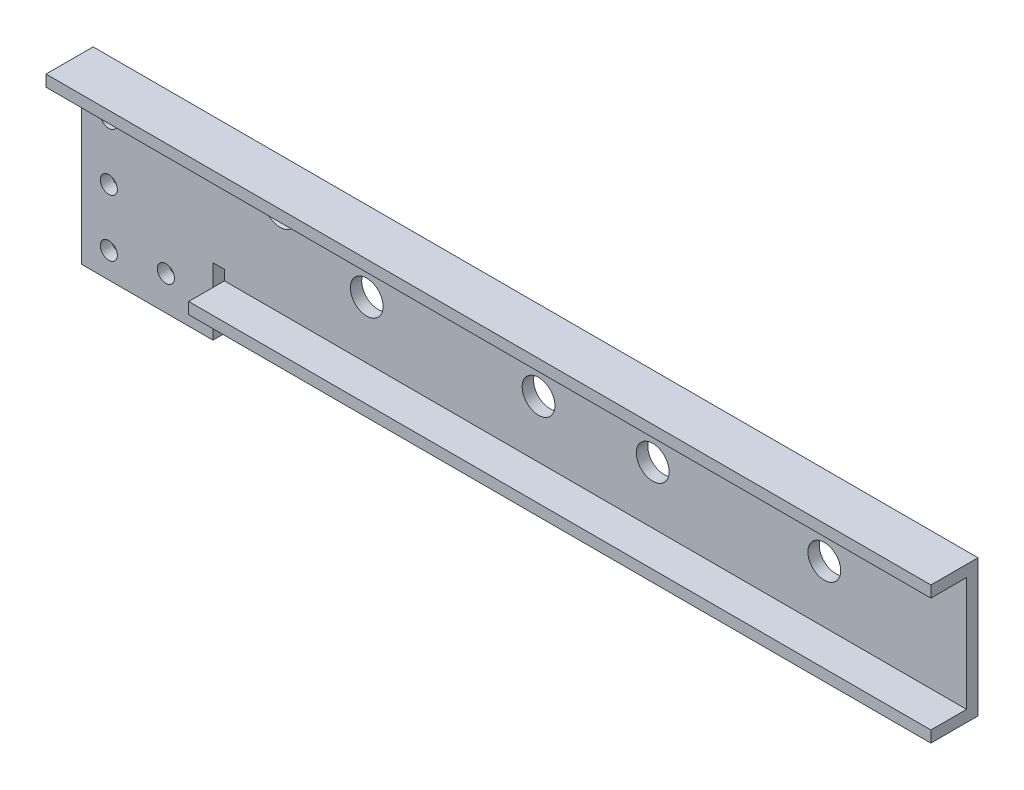
ISO-10303-21;
HEADER;
FILE_DESCRIPTION(('STEP AP214'),'2;1');
FILE_NAME('part.step','',(''),(''),'','','');
FILE_SCHEMA(('AUTOMOTIVE_DESIGN { 1 0 10303 214 1 1 1 1 }'));
ENDSEC;
DATA;
#1=APPLICATION_CONTEXT('core data for automotive mechanical design processes');
#2=APPLICATION_PROTOCOL_DEFINITION('international standard','automotive_design',2000,#1);
#3=PRODUCT_CONTEXT('',#1,'mechanical');
#4=PRODUCT('Part','Part','',(#3));
#5=PRODUCT_RELATED_PRODUCT_CATEGORY('part','',(#4));
#6=PRODUCT_DEFINITION_FORMATION('','',#4);
#7=PRODUCT_DEFINITION_CONTEXT('part definition',#1,'design');
#8=PRODUCT_DEFINITION('design','',#6,#7);
#9=PRODUCT_DEFINITION_SHAPE('','',#8);
#10=(LENGTH_UNIT() NAMED_UNIT(*) SI_UNIT(.MILLI.,.METRE.));
#11=(NAMED_UNIT(*) PLANE_ANGLE_UNIT() SI_UNIT($,.RADIAN.));
#12=(NAMED_UNIT(*) SI_UNIT($,.STERADIAN.) SOLID_ANGLE_UNIT());
#13=UNCERTAINTY_MEASURE_WITH_UNIT(LENGTH_MEASURE(1.E-05),#10,'distance_accuracy_value','');
#14=(GEOMETRIC_REPRESENTATION_CONTEXT(3) GLOBAL_UNCERTAINTY_ASSIGNED_CONTEXT((#13)) GLOBAL_UNIT_ASSIGNED_CONTEXT((#10,
#11,#12)) REPRESENTATION_CONTEXT('',''));
#15=CARTESIAN_POINT('',(0.,0.,0.));
#16=DIRECTION('',(0.,0.,1.));
#17=DIRECTION('',(1.,0.,0.));
#18=AXIS2_PLACEMENT_3D('',#15,#16,#17);
#19=CARTESIAN_POINT('',(0.,0.,2.));
#20=DIRECTION('',(0.,0.,1.));
#21=DIRECTION('',(1.,0.,0.));
#22=AXIS2_PLACEMENT_3D('',#19,#20,#21);
#23=PLANE('',#22);
#24=CARTESIAN_POINT('',(34.75,-6.00000000000005,2.));
#25=DIRECTION('',(0.,0.,1.));
#26=DIRECTION('',(1.,0.,0.));
#27=AXIS2_PLACEMENT_3D('',#24,#25,#26);
#28=CIRCLE('',#27,3.00000000000002);
#29=CARTESIAN_POINT('',(37.75,-6.00000000000005,2.));
#30=VERTEX_POINT('',#29);
#31=EDGE_CURVE('E11',#30,#30,#28,.F.);
#32=ORIENTED_EDGE('',*,*,#31,.T.);
#33=EDGE_LOOP('',(#32));
#34=FACE_BOUND('',#33,.T.);
#35=CARTESIAN_POINT('',(14.75,-6.00000000000005,2.));
#36=DIRECTION('',(0.,0.,1.));
#37=DIRECTION('',(1.,0.,0.));
#38=AXIS2_PLACEMENT_3D('',#35,#36,#37);
#39=CIRCLE('',#38,1.5);
#40=CARTESIAN_POINT('',(16.25,-6.00000000000005,2.));
#41=VERTEX_POINT('',#40);
#42=EDGE_CURVE('E165',#41,#41,#39,.T.);
#43=ORIENTED_EDGE('',*,*,#42,.F.);
#44=EDGE_LOOP('',(#43));
#45=FACE_BOUND('',#44,.T.);
#46=CARTESIAN_POINT('',(14.75,-26.0000000000001,2.));
#47=DIRECTION('',(0.,0.,1.));
#48=DIRECTION('',(1.,0.,0.));
#49=AXIS2_PLACEMENT_3D('',#46,#47,#48);
#50=CIRCLE('',#49,1.5);
#51=CARTESIAN_POINT('',(16.25,-26.0000000000001,2.));
#52=VERTEX_POINT('',#51);
#53=EDGE_CURVE('E160',#52,#52,#50,.T.);
#54=ORIENTED_EDGE('',*,*,#53,.F.);
#55=EDGE_LOOP('',(#54));
#56=FACE_BOUND('',#55,.T.);
#57=CARTESIAN_POINT('',(100.025,-12.,2.));
#58=DIRECTION('',(0.,0.,1.));
#59=DIRECTION('',(1.,0.,0.));
#60=AXIS2_PLACEMENT_3D('',#57,#58,#59);
#61=CIRCLE('',#60,2.875);
#62=CARTESIAN_POINT('',(102.9,-12.,2.));
#63=VERTEX_POINT('',#62);
#64=EDGE_CURVE('E150',#63,#63,#61,.T.);
#65=ORIENTED_EDGE('',*,*,#64,.F.);
#66=EDGE_LOOP('',(#65));
#67=FACE_BOUND('',#66,.T.);
#68=CARTESIAN_POINT('',(80.025,-12.,2.));
#69=DIRECTION('',(0.,0.,1.));
#70=DIRECTION('',(1.,0.,0.));
#71=AXIS2_PLACEMENT_3D('',#68,#69,#70);
#72=CIRCLE('',#71,2.875);
#73=CARTESIAN_POINT('',(82.9,-12.,2.));
#74=VERTEX_POINT('',#73);
#75=EDGE_CURVE('E288',#74,#74,#72,.T.);
#76=ORIENTED_EDGE('',*,*,#75,.F.);
#77=EDGE_LOOP('',(#76));
#78=FACE_BOUND('',#77,.T.);
#79=CARTESIAN_POINT('',(49.925,-12.,2.));
#80=DIRECTION('',(0.,0.,1.));
#81=DIRECTION('',(1.,0.,0.));
#82=AXIS2_PLACEMENT_3D('',#79,#80,#81);
#83=CIRCLE('',#82,2.875);
#84=CARTESIAN_POINT('',(52.8,-12.,2.));
#85=VERTEX_POINT('',#84);
#86=EDGE_CURVE('E159',#85,#85,#83,.T.);
#87=ORIENTED_EDGE('',*,*,#86,.F.);
#88=EDGE_LOOP('',(#87));
#89=FACE_BOUND('',#88,.T.);
#90=CARTESIAN_POINT('',(130.075,-12.,2.));
#91=DIRECTION('',(0.,0.,1.));
#92=DIRECTION('',(1.,0.,0.));
#93=AXIS2_PLACEMENT_3D('',#90,#91,#92);
#94=CIRCLE('',#93,2.87499999999999);
#95=CARTESIAN_POINT('',(132.95,-12.,2.));
#96=VERTEX_POINT('',#95);
#97=EDGE_CURVE('E145',#96,#96,#94,.T.);
#98=ORIENTED_EDGE('',*,*,#97,.F.);
#99=EDGE_LOOP('',(#98));
#100=FACE_BOUND('',#99,.T.);
#101=CARTESIAN_POINT('',(4.75,-17.5,2.));
#102=DIRECTION('',(0.,0.,1.));
#103=DIRECTION('',(1.,0.,0.));
#104=AXIS2_PLACEMENT_3D('',#101,#102,#103);
#105=CIRCLE('',#104,1.5);
#106=CARTESIAN_POINT('',(6.25,-17.5,2.));
#107=VERTEX_POINT('',#106);
#108=EDGE_CURVE('E138',#107,#107,#105,.T.);
#109=ORIENTED_EDGE('',*,*,#108,.F.);
#110=EDGE_LOOP('',(#109));
#111=FACE_BOUND('',#110,.T.);
#112=CARTESIAN_POINT('',(4.75,-7.50000000000001,2.));
#113=DIRECTION('',(0.,0.,1.));
#114=DIRECTION('',(1.,0.,0.));
#115=AXIS2_PLACEMENT_3D('',#112,#113,#114);
#116=CIRCLE('',#115,1.5);
#117=CARTESIAN_POINT('',(6.25,-7.50000000000001,2.));
#118=VERTEX_POINT('',#117);
#119=EDGE_CURVE('E144',#118,#118,#116,.T.);
#120=ORIENTED_EDGE('',*,*,#119,.F.);
#121=EDGE_LOOP('',(#120));
#122=FACE_BOUND('',#121,.T.);
#123=CARTESIAN_POINT('',(4.75,-27.5,2.));
#124=DIRECTION('',(0.,0.,1.));
#125=DIRECTION('',(1.,0.,0.));
#126=AXIS2_PLACEMENT_3D('',#123,#124,#125);
#127=CIRCLE('',#126,1.5);
#128=CARTESIAN_POINT('',(6.25,-27.5,2.));
#129=VERTEX_POINT('',#128);
#130=EDGE_CURVE('E133',#129,#129,#127,.T.);
#131=ORIENTED_EDGE('',*,*,#130,.F.);
#132=EDGE_LOOP('',(#131));
#133=FACE_BOUND('',#132,.T.);
#134=DIRECTION('',(0.,-1.,0.));
#135=VECTOR('',#134,1.);
#136=CARTESIAN_POINT('',(23.,-32.,2.));
#137=LINE('',#136,#135);
#138=CARTESIAN_POINT('',(23.,-20.25,2.));
#139=VERTEX_POINT('',#138);
#140=CARTESIAN_POINT('',(23.,-32.,2.));
#141=VERTEX_POINT('',#140);
#142=EDGE_CURVE('E267',#139,#141,#137,.T.);
#143=ORIENTED_EDGE('',*,*,#142,.F.);
#144=DIRECTION('',(-1.,0.,0.));
#145=VECTOR('',#144,1.);
#146=CARTESIAN_POINT('',(23.,-20.25,2.));
#147=LINE('',#146,#145);
#148=CARTESIAN_POINT('',(25.,-20.25,2.));
#149=VERTEX_POINT('',#148);
#150=EDGE_CURVE('E273',#149,#139,#147,.T.);
#151=ORIENTED_EDGE('',*,*,#150,.F.);
#152=DIRECTION('',(0.,1.,0.));
#153=VECTOR('',#152,1.);
#154=CARTESIAN_POINT('',(25.,-24.,2.));
#155=LINE('',#154,#153);
#156=CARTESIAN_POINT('',(25.,-22.,2.));
#157=VERTEX_POINT('',#156);
#158=EDGE_CURVE('E132',#157,#149,#155,.T.);
#159=ORIENTED_EDGE('',*,*,#158,.F.);
#160=DIRECTION('',(-1.,0.,0.));
#161=VECTOR('',#160,1.);
#162=CARTESIAN_POINT('',(155.,-22.,2.));
#163=LINE('',#162,#161);
#164=CARTESIAN_POINT('',(155.,-22.,2.));
#165=VERTEX_POINT('',#164);
#166=EDGE_CURVE('E249',#165,#157,#163,.T.);
#167=ORIENTED_EDGE('',*,*,#166,.F.);
#168=DIRECTION('',(0.,1.,0.));
#169=VECTOR('',#168,1.);
#170=CARTESIAN_POINT('',(155.,0.,2.));
#171=LINE('',#170,#169);
#172=CARTESIAN_POINT('',(155.,-2.,2.));
#173=VERTEX_POINT('',#172);
#174=EDGE_CURVE('E115',#165,#173,#171,.T.);
#175=ORIENTED_EDGE('',*,*,#174,.T.);
#176=DIRECTION('',(1.,0.,0.));
#177=VECTOR('',#176,1.);
#178=CARTESIAN_POINT('',(155.,-2.,2.));
#179=LINE('',#178,#177);
#180=CARTESIAN_POINT('',(0.,-2.00000000000001,2.));
#181=VERTEX_POINT('',#180);
#182=EDGE_CURVE('E53',#181,#173,#179,.T.);
#183=ORIENTED_EDGE('',*,*,#182,.F.);
#184=DIRECTION('',(0.,-1.,0.));
#185=VECTOR('',#184,1.);
#186=CARTESIAN_POINT('',(0.,0.,2.));
#187=LINE('',#186,#185);
#188=CARTESIAN_POINT('',(0.,-32.,2.));
#189=VERTEX_POINT('',#188);
#190=EDGE_CURVE('E58',#181,#189,#187,.T.);
#191=ORIENTED_EDGE('',*,*,#190,.T.);
#192=DIRECTION('',(1.,0.,0.));
#193=VECTOR('',#192,1.);
#194=CARTESIAN_POINT('',(0.,-32.,2.));
#195=LINE('',#194,#193);
#196=EDGE_CURVE('E111',#189,#141,#195,.T.);
#197=ORIENTED_EDGE('',*,*,#196,.T.);
#198=EDGE_LOOP('',(#143,#151,#159,#167,#175,#183,#191,#197));
#199=FACE_BOUND('',#198,.T.);
#200=ADVANCED_FACE('F38',(#34,#45,#56,#67,#78,#89,#100,#111,#122,#133,#199),#23,.T.);
#201=CARTESIAN_POINT('',(0.,0.,2.));
#202=DIRECTION('',(1.,0.,0.));
#203=DIRECTION('',(0.,1.,0.));
#204=AXIS2_PLACEMENT_3D('',#201,#202,#203);
#205=PLANE('',#204);
#206=DIRECTION('',(0.,-1.,0.));
#207=VECTOR('',#206,1.);
#208=CARTESIAN_POINT('',(0.,0.,0.));
#209=LINE('',#208,#207);
#210=CARTESIAN_POINT('',(0.,0.,0.));
#211=VERTEX_POINT('',#210);
#212=CARTESIAN_POINT('',(0.,-32.,0.));
#213=VERTEX_POINT('',#212);
#214=EDGE_CURVE('E107',#211,#213,#209,.T.);
#215=ORIENTED_EDGE('',*,*,#214,.T.);
#216=DIRECTION('',(0.,0.,-1.));
#217=VECTOR('',#216,1.);
#218=CARTESIAN_POINT('',(0.,-32.,2.));
#219=LINE('',#218,#217);
#220=EDGE_CURVE('E100',#189,#213,#219,.T.);
#221=ORIENTED_EDGE('',*,*,#220,.F.);
#222=ORIENTED_EDGE('',*,*,#190,.F.);
#223=DIRECTION('',(0.,0.,-1.));
#224=VECTOR('',#223,1.);
#225=CARTESIAN_POINT('',(0.,-2.00000000000002,8.25));
#226=LINE('',#225,#224);
#227=CARTESIAN_POINT('',(0.,-2.00000000000002,8.25));
#228=VERTEX_POINT('',#227);
#229=EDGE_CURVE('E217',#228,#181,#226,.T.);
#230=ORIENTED_EDGE('',*,*,#229,.F.);
#231=DIRECTION('',(0.,-1.,0.));
#232=VECTOR('',#231,1.);
#233=CARTESIAN_POINT('',(0.,0.,8.25));
#234=LINE('',#233,#232);
#235=CARTESIAN_POINT('',(0.,0.,8.25));
#236=VERTEX_POINT('',#235);
#237=EDGE_CURVE('E234',#236,#228,#234,.T.);
#238=ORIENTED_EDGE('',*,*,#237,.F.);
#239=DIRECTION('',(0.,0.,-1.));
#240=VECTOR('',#239,1.);
#241=CARTESIAN_POINT('',(0.,0.,2.));
#242=LINE('',#241,#240);
#243=EDGE_CURVE('E101',#236,#211,#242,.T.);
#244=ORIENTED_EDGE('',*,*,#243,.T.);
#245=EDGE_LOOP('',(#215,#221,#222,#230,#238,#244));
#246=FACE_BOUND('',#245,.T.);
#247=ADVANCED_FACE('F183',(#246),#205,.F.);
#248=CARTESIAN_POINT('',(0.,-32.,2.));
#249=DIRECTION('',(0.,1.,0.));
#250=DIRECTION('',(0.,0.,1.));
#251=AXIS2_PLACEMENT_3D('',#248,#249,#250);
#252=PLANE('',#251);
#253=DIRECTION('',(1.,0.,0.));
#254=VECTOR('',#253,1.);
#255=CARTESIAN_POINT('',(0.,-32.,0.));
#256=LINE('',#255,#254);
#257=CARTESIAN_POINT('',(23.,-32.,0.));
#258=VERTEX_POINT('',#257);
#259=EDGE_CURVE('E91',#213,#258,#256,.T.);
#260=ORIENTED_EDGE('',*,*,#259,.T.);
#261=DIRECTION('',(0.,0.,1.));
#262=VECTOR('',#261,1.);
#263=CARTESIAN_POINT('',(23.,-32.,-4.25));
#264=LINE('',#263,#262);
#265=EDGE_CURVE('E212',#258,#141,#264,.T.);
#266=ORIENTED_EDGE('',*,*,#265,.T.);
#267=ORIENTED_EDGE('',*,*,#196,.F.);
#268=ORIENTED_EDGE('',*,*,#220,.T.);
#269=EDGE_LOOP('',(#260,#266,#267,#268));
#270=FACE_BOUND('',#269,.T.);
#271=ADVANCED_FACE('F189',(#270),#252,.F.);
#272=CARTESIAN_POINT('',(155.,0.,2.));
#273=DIRECTION('',(-1.,0.,0.));
#274=DIRECTION('',(0.,0.,1.));
#275=AXIS2_PLACEMENT_3D('',#272,#273,#274);
#276=PLANE('',#275);
#277=DIRECTION('',(0.,0.,-1.));
#278=VECTOR('',#277,1.);
#279=CARTESIAN_POINT('',(155.,-24.,8.25));
#280=LINE('',#279,#278);
#281=CARTESIAN_POINT('',(155.,-24.,8.25));
#282=VERTEX_POINT('',#281);
#283=CARTESIAN_POINT('',(155.,-24.,0.));
#284=VERTEX_POINT('',#283);
#285=EDGE_CURVE('E85',#282,#284,#280,.T.);
#286=ORIENTED_EDGE('',*,*,#285,.T.);
#287=DIRECTION('',(0.,1.,0.));
#288=VECTOR('',#287,1.);
#289=CARTESIAN_POINT('',(155.,0.,0.));
#290=LINE('',#289,#288);
#291=CARTESIAN_POINT('',(155.,0.,0.));
#292=VERTEX_POINT('',#291);
#293=EDGE_CURVE('E75',#284,#292,#290,.T.);
#294=ORIENTED_EDGE('',*,*,#293,.T.);
#295=DIRECTION('',(0.,0.,-1.));
#296=VECTOR('',#295,1.);
#297=CARTESIAN_POINT('',(155.,0.,2.));
#298=LINE('',#297,#296);
#299=CARTESIAN_POINT('',(155.,0.,8.25));
#300=VERTEX_POINT('',#299);
#301=EDGE_CURVE('E80',#300,#292,#298,.T.);
#302=ORIENTED_EDGE('',*,*,#301,.F.);
#303=DIRECTION('',(0.,1.,0.));
#304=VECTOR('',#303,1.);
#305=CARTESIAN_POINT('',(155.,0.,8.25));
#306=LINE('',#305,#304);
#307=CARTESIAN_POINT('',(155.,-2.,8.25));
#308=VERTEX_POINT('',#307);
#309=EDGE_CURVE('E229',#308,#300,#306,.T.);
#310=ORIENTED_EDGE('',*,*,#309,.F.);
#311=DIRECTION('',(0.,0.,-1.));
#312=VECTOR('',#311,1.);
#313=CARTESIAN_POINT('',(155.,-2.,8.25));
#314=LINE('',#313,#312);
#315=EDGE_CURVE('E224',#308,#173,#314,.T.);
#316=ORIENTED_EDGE('',*,*,#315,.T.);
#317=ORIENTED_EDGE('',*,*,#174,.F.);
#318=DIRECTION('',(0.,0.,-1.));
#319=VECTOR('',#318,1.);
#320=CARTESIAN_POINT('',(155.,-22.,8.25));
#321=LINE('',#320,#319);
#322=CARTESIAN_POINT('',(155.,-22.,8.25));
#323=VERTEX_POINT('',#322);
#324=EDGE_CURVE('E230',#323,#165,#321,.T.);
#325=ORIENTED_EDGE('',*,*,#324,.F.);
#326=DIRECTION('',(0.,1.,0.));
#327=VECTOR('',#326,1.);
#328=CARTESIAN_POINT('',(155.,-24.,8.25));
#329=LINE('',#328,#327);
#330=EDGE_CURVE('E252',#282,#323,#329,.T.);
#331=ORIENTED_EDGE('',*,*,#330,.F.);
#332=EDGE_LOOP('',(#286,#294,#302,#310,#316,#317,#325,#331));
#333=FACE_BOUND('',#332,.T.);
#334=ADVANCED_FACE('F77',(#333),#276,.F.);
#335=CARTESIAN_POINT('',(0.,0.,2.));
#336=DIRECTION('',(0.,-1.,0.));
#337=DIRECTION('',(0.,0.,-1.));
#338=AXIS2_PLACEMENT_3D('',#335,#336,#337);
#339=PLANE('',#338);
#340=DIRECTION('',(-1.,0.,0.));
#341=VECTOR('',#340,1.);
#342=CARTESIAN_POINT('',(0.,0.,0.));
#343=LINE('',#342,#341);
#344=EDGE_CURVE('E90',#292,#211,#343,.T.);
#345=ORIENTED_EDGE('',*,*,#344,.T.);
#346=ORIENTED_EDGE('',*,*,#243,.F.);
#347=DIRECTION('',(-1.,0.,0.));
#348=VECTOR('',#347,1.);
#349=CARTESIAN_POINT('',(155.,0.,8.25));
#350=LINE('',#349,#348);
#351=EDGE_CURVE('E98',#300,#236,#350,.T.);
#352=ORIENTED_EDGE('',*,*,#351,.F.);
#353=ORIENTED_EDGE('',*,*,#301,.T.);
#354=EDGE_LOOP('',(#345,#346,#352,#353));
#355=FACE_BOUND('',#354,.T.);
#356=ADVANCED_FACE('F94',(#355),#339,.F.);
#357=CARTESIAN_POINT('',(0.,0.,0.));
#358=DIRECTION('',(0.,0.,1.));
#359=DIRECTION('',(1.,0.,0.));
#360=AXIS2_PLACEMENT_3D('',#357,#358,#359);
#361=PLANE('',#360);
#362=CARTESIAN_POINT('',(14.75,-6.00000000000005,0.));
#363=DIRECTION('',(0.,0.,1.));
#364=DIRECTION('',(1.,0.,0.));
#365=AXIS2_PLACEMENT_3D('',#362,#363,#364);
#366=CIRCLE('',#365,1.5);
#367=CARTESIAN_POINT('',(16.25,-6.00000000000005,0.));
#368=VERTEX_POINT('',#367);
#369=EDGE_CURVE('E164',#368,#368,#366,.T.);
#370=ORIENTED_EDGE('',*,*,#369,.T.);
#371=EDGE_LOOP('',(#370));
#372=FACE_BOUND('',#371,.T.);
#373=CARTESIAN_POINT('',(34.75,-6.00000000000005,0.));
#374=DIRECTION('',(0.,0.,1.));
#375=DIRECTION('',(1.,0.,0.));
#376=AXIS2_PLACEMENT_3D('',#373,#374,#375);
#377=CIRCLE('',#376,1.5);
#378=CARTESIAN_POINT('',(36.25,-6.00000000000005,0.));
#379=VERTEX_POINT('',#378);
#380=EDGE_CURVE('E161',#379,#379,#377,.T.);
#381=ORIENTED_EDGE('',*,*,#380,.T.);
#382=EDGE_LOOP('',(#381));
#383=FACE_BOUND('',#382,.T.);
#384=CARTESIAN_POINT('',(14.75,-26.0000000000001,0.));
#385=DIRECTION('',(0.,0.,1.));
#386=DIRECTION('',(1.,0.,0.));
#387=AXIS2_PLACEMENT_3D('',#384,#385,#386);
#388=CIRCLE('',#387,1.5);
#389=CARTESIAN_POINT('',(16.25,-26.0000000000001,0.));
#390=VERTEX_POINT('',#389);
#391=EDGE_CURVE('E156',#390,#390,#388,.T.);
#392=ORIENTED_EDGE('',*,*,#391,.T.);
#393=EDGE_LOOP('',(#392));
#394=FACE_BOUND('',#393,.T.);
#395=CARTESIAN_POINT('',(100.025,-12.,0.));
#396=DIRECTION('',(0.,0.,1.));
#397=DIRECTION('',(1.,0.,0.));
#398=AXIS2_PLACEMENT_3D('',#395,#396,#397);
#399=CIRCLE('',#398,2.875);
#400=CARTESIAN_POINT('',(102.9,-12.,0.));
#401=VERTEX_POINT('',#400);
#402=EDGE_CURVE('E153',#401,#401,#399,.T.);
#403=ORIENTED_EDGE('',*,*,#402,.T.);
#404=EDGE_LOOP('',(#403));
#405=FACE_BOUND('',#404,.T.);
#406=CARTESIAN_POINT('',(80.025,-12.,0.));
#407=DIRECTION('',(0.,0.,1.));
#408=DIRECTION('',(1.,0.,0.));
#409=AXIS2_PLACEMENT_3D('',#406,#407,#408);
#410=CIRCLE('',#409,2.875);
#411=CARTESIAN_POINT('',(82.9,-12.,0.));
#412=VERTEX_POINT('',#411);
#413=EDGE_CURVE('E149',#412,#412,#410,.T.);
#414=ORIENTED_EDGE('',*,*,#413,.T.);
#415=EDGE_LOOP('',(#414));
#416=FACE_BOUND('',#415,.T.);
#417=CARTESIAN_POINT('',(49.925,-12.,0.));
#418=DIRECTION('',(0.,0.,1.));
#419=DIRECTION('',(1.,0.,0.));
#420=AXIS2_PLACEMENT_3D('',#417,#418,#419);
#421=CIRCLE('',#420,2.875);
#422=CARTESIAN_POINT('',(52.8,-12.,0.));
#423=VERTEX_POINT('',#422);
#424=EDGE_CURVE('E146',#423,#423,#421,.T.);
#425=ORIENTED_EDGE('',*,*,#424,.T.);
#426=EDGE_LOOP('',(#425));
#427=FACE_BOUND('',#426,.T.);
#428=CARTESIAN_POINT('',(130.075,-12.,0.));
#429=DIRECTION('',(0.,0.,1.));
#430=DIRECTION('',(1.,0.,0.));
#431=AXIS2_PLACEMENT_3D('',#428,#429,#430);
#432=CIRCLE('',#431,2.87499999999999);
#433=CARTESIAN_POINT('',(132.95,-12.,0.));
#434=VERTEX_POINT('',#433);
#435=EDGE_CURVE('E141',#434,#434,#432,.T.);
#436=ORIENTED_EDGE('',*,*,#435,.T.);
#437=EDGE_LOOP('',(#436));
#438=FACE_BOUND('',#437,.T.);
#439=CARTESIAN_POINT('',(4.75,-17.5,0.));
#440=DIRECTION('',(0.,0.,1.));
#441=DIRECTION('',(1.,0.,0.));
#442=AXIS2_PLACEMENT_3D('',#439,#440,#441);
#443=CIRCLE('',#442,1.5);
#444=CARTESIAN_POINT('',(6.25,-17.5,0.));
#445=VERTEX_POINT('',#444);
#446=EDGE_CURVE('E137',#445,#445,#443,.T.);
#447=ORIENTED_EDGE('',*,*,#446,.T.);
#448=EDGE_LOOP('',(#447));
#449=FACE_BOUND('',#448,.T.);
#450=CARTESIAN_POINT('',(4.75,-7.50000000000001,0.));
#451=DIRECTION('',(0.,0.,1.));
#452=DIRECTION('',(1.,0.,0.));
#453=AXIS2_PLACEMENT_3D('',#450,#451,#452);
#454=CIRCLE('',#453,1.5);
#455=CARTESIAN_POINT('',(6.25,-7.50000000000001,0.));
#456=VERTEX_POINT('',#455);
#457=EDGE_CURVE('E134',#456,#456,#454,.T.);
#458=ORIENTED_EDGE('',*,*,#457,.T.);
#459=EDGE_LOOP('',(#458));
#460=FACE_BOUND('',#459,.T.);
#461=CARTESIAN_POINT('',(4.75,-27.5,0.));
#462=DIRECTION('',(0.,0.,1.));
#463=DIRECTION('',(1.,0.,0.));
#464=AXIS2_PLACEMENT_3D('',#461,#462,#463);
#465=CIRCLE('',#464,1.5);
#466=CARTESIAN_POINT('',(6.25,-27.5,0.));
#467=VERTEX_POINT('',#466);
#468=EDGE_CURVE('E129',#467,#467,#465,.T.);
#469=ORIENTED_EDGE('',*,*,#468,.T.);
#470=EDGE_LOOP('',(#469));
#471=FACE_BOUND('',#470,.T.);
#472=DIRECTION('',(-1.,0.,0.));
#473=VECTOR('',#472,1.);
#474=CARTESIAN_POINT('',(0.,-20.25,0.));
#475=LINE('',#474,#473);
#476=CARTESIAN_POINT('',(25.,-20.25,0.));
#477=VERTEX_POINT('',#476);
#478=CARTESIAN_POINT('',(23.,-20.25,0.));
#479=VERTEX_POINT('',#478);
#480=EDGE_CURVE('E124',#477,#479,#475,.T.);
#481=ORIENTED_EDGE('',*,*,#480,.T.);
#482=DIRECTION('',(0.,-1.,0.));
#483=VECTOR('',#482,1.);
#484=CARTESIAN_POINT('',(23.,0.,0.));
#485=LINE('',#484,#483);
#486=EDGE_CURVE('E126',#479,#258,#485,.T.);
#487=ORIENTED_EDGE('',*,*,#486,.T.);
#488=ORIENTED_EDGE('',*,*,#259,.F.);
#489=ORIENTED_EDGE('',*,*,#214,.F.);
#490=ORIENTED_EDGE('',*,*,#344,.F.);
#491=ORIENTED_EDGE('',*,*,#293,.F.);
#492=DIRECTION('',(-1.,0.,0.));
#493=VECTOR('',#492,1.);
#494=CARTESIAN_POINT('',(0.,-24.,0.));
#495=LINE('',#494,#493);
#496=CARTESIAN_POINT('',(25.,-24.,0.));
#497=VERTEX_POINT('',#496);
#498=EDGE_CURVE('E119',#284,#497,#495,.T.);
#499=ORIENTED_EDGE('',*,*,#498,.T.);
#500=DIRECTION('',(0.,1.,0.));
#501=VECTOR('',#500,1.);
#502=CARTESIAN_POINT('',(25.,0.,0.));
#503=LINE('',#502,#501);
#504=EDGE_CURVE('E121',#497,#477,#503,.T.);
#505=ORIENTED_EDGE('',*,*,#504,.T.);
#506=EDGE_LOOP('',(#481,#487,#488,#489,#490,#491,#499,#505));
#507=FACE_BOUND('',#506,.T.);
#508=ADVANCED_FACE('F105',(#372,#383,#394,#405,#416,#427,#438,#449,#460,#471,#507),#361,.F.);
#509=CARTESIAN_POINT('',(155.,-2.,8.25));
#510=DIRECTION('',(0.,1.,0.));
#511=DIRECTION('',(-1.,0.,0.));
#512=AXIS2_PLACEMENT_3D('',#509,#510,#511);
#513=PLANE('',#512);
#514=ORIENTED_EDGE('',*,*,#182,.T.);
#515=ORIENTED_EDGE('',*,*,#315,.F.);
#516=DIRECTION('',(1.,0.,0.));
#517=VECTOR('',#516,1.);
#518=CARTESIAN_POINT('',(155.,-2.,8.25));
#519=LINE('',#518,#517);
#520=EDGE_CURVE('E227',#228,#308,#519,.T.);
#521=ORIENTED_EDGE('',*,*,#520,.F.);
#522=ORIENTED_EDGE('',*,*,#229,.T.);
#523=EDGE_LOOP('',(#514,#515,#521,#522));
#524=FACE_BOUND('',#523,.T.);
#525=ADVANCED_FACE('F194',(#524),#513,.F.);
#526=CARTESIAN_POINT('',(0.,0.,8.25));
#527=DIRECTION('',(0.,0.,-1.));
#528=DIRECTION('',(-1.,0.,0.));
#529=AXIS2_PLACEMENT_3D('',#526,#527,#528);
#530=PLANE('',#529);
#531=ORIENTED_EDGE('',*,*,#309,.T.);
#532=ORIENTED_EDGE('',*,*,#351,.T.);
#533=ORIENTED_EDGE('',*,*,#237,.T.);
#534=ORIENTED_EDGE('',*,*,#520,.T.);
#535=EDGE_LOOP('',(#531,#532,#533,#534));
#536=FACE_BOUND('',#535,.T.);
#537=ADVANCED_FACE('F353',(#536),#530,.F.);
#538=CARTESIAN_POINT('',(155.,-22.,8.25));
#539=DIRECTION('',(0.,-1.,0.));
#540=DIRECTION('',(1.,0.,0.));
#541=AXIS2_PLACEMENT_3D('',#538,#539,#540);
#542=PLANE('',#541);
#543=ORIENTED_EDGE('',*,*,#166,.T.);
#544=DIRECTION('',(0.,0.,-1.));
#545=VECTOR('',#544,1.);
#546=CARTESIAN_POINT('',(25.,-22.,8.25));
#547=LINE('',#546,#545);
#548=CARTESIAN_POINT('',(25.,-22.,8.25));
#549=VERTEX_POINT('',#548);
#550=EDGE_CURVE('E241',#549,#157,#547,.T.);
#551=ORIENTED_EDGE('',*,*,#550,.F.);
#552=DIRECTION('',(-1.,0.,0.));
#553=VECTOR('',#552,1.);
#554=CARTESIAN_POINT('',(155.,-22.,8.25));
#555=LINE('',#554,#553);
#556=EDGE_CURVE('E258',#323,#549,#555,.T.);
#557=ORIENTED_EDGE('',*,*,#556,.F.);
#558=ORIENTED_EDGE('',*,*,#324,.T.);
#559=EDGE_LOOP('',(#543,#551,#557,#558));
#560=FACE_BOUND('',#559,.T.);
#561=ADVANCED_FACE('F362',(#560),#542,.F.);
#562=CARTESIAN_POINT('',(25.,-24.,8.25));
#563=DIRECTION('',(1.,0.,0.));
#564=DIRECTION('',(0.,0.,-1.));
#565=AXIS2_PLACEMENT_3D('',#562,#563,#564);
#566=PLANE('',#565);
#567=ORIENTED_EDGE('',*,*,#550,.T.);
#568=ORIENTED_EDGE('',*,*,#158,.T.);
#569=DIRECTION('',(0.,0.,1.));
#570=VECTOR('',#569,1.);
#571=CARTESIAN_POINT('',(25.,-20.25,-4.25));
#572=LINE('',#571,#570);
#573=EDGE_CURVE('E263',#477,#149,#572,.T.);
#574=ORIENTED_EDGE('',*,*,#573,.F.);
#575=ORIENTED_EDGE('',*,*,#504,.F.);
#576=DIRECTION('',(0.,0.,-1.));
#577=VECTOR('',#576,1.);
#578=CARTESIAN_POINT('',(25.,-24.,8.25));
#579=LINE('',#578,#577);
#580=CARTESIAN_POINT('',(25.,-24.,8.25));
#581=VERTEX_POINT('',#580);
#582=EDGE_CURVE('E244',#581,#497,#579,.T.);
#583=ORIENTED_EDGE('',*,*,#582,.F.);
#584=DIRECTION('',(0.,-1.,0.));
#585=VECTOR('',#584,1.);
#586=CARTESIAN_POINT('',(25.,-24.,8.25));
#587=LINE('',#586,#585);
#588=EDGE_CURVE('E255',#549,#581,#587,.T.);
#589=ORIENTED_EDGE('',*,*,#588,.F.);
#590=EDGE_LOOP('',(#567,#568,#574,#575,#583,#589));
#591=FACE_BOUND('',#590,.T.);
#592=ADVANCED_FACE('F365',(#591),#566,.F.);
#593=CARTESIAN_POINT('',(155.,-24.,8.25));
#594=DIRECTION('',(0.,1.,0.));
#595=DIRECTION('',(-1.,0.,0.));
#596=AXIS2_PLACEMENT_3D('',#593,#594,#595);
#597=PLANE('',#596);
#598=ORIENTED_EDGE('',*,*,#582,.T.);
#599=ORIENTED_EDGE('',*,*,#498,.F.);
#600=ORIENTED_EDGE('',*,*,#285,.F.);
#601=DIRECTION('',(1.,0.,0.));
#602=VECTOR('',#601,1.);
#603=CARTESIAN_POINT('',(155.,-24.,8.25));
#604=LINE('',#603,#602);
#605=EDGE_CURVE('E248',#581,#282,#604,.T.);
#606=ORIENTED_EDGE('',*,*,#605,.F.);
#607=EDGE_LOOP('',(#598,#599,#600,#606));
#608=FACE_BOUND('',#607,.T.);
#609=ADVANCED_FACE('F373',(#608),#597,.F.);
#610=CARTESIAN_POINT('',(0.,0.,8.25));
#611=DIRECTION('',(0.,0.,1.));
#612=DIRECTION('',(1.,0.,0.));
#613=AXIS2_PLACEMENT_3D('',#610,#611,#612);
#614=PLANE('',#613);
#615=ORIENTED_EDGE('',*,*,#330,.T.);
#616=ORIENTED_EDGE('',*,*,#556,.T.);
#617=ORIENTED_EDGE('',*,*,#588,.T.);
#618=ORIENTED_EDGE('',*,*,#605,.T.);
#619=EDGE_LOOP('',(#615,#616,#617,#618));
#620=FACE_BOUND('',#619,.T.);
#621=ADVANCED_FACE('F371',(#620),#614,.T.);
#622=CARTESIAN_POINT('',(23.,-32.,-4.25));
#623=DIRECTION('',(-1.,0.,0.));
#624=DIRECTION('',(0.,0.,1.));
#625=AXIS2_PLACEMENT_3D('',#622,#623,#624);
#626=PLANE('',#625);
#627=DIRECTION('',(0.,0.,1.));
#628=VECTOR('',#627,1.);
#629=CARTESIAN_POINT('',(23.,-20.25,-4.25));
#630=LINE('',#629,#628);
#631=EDGE_CURVE('E266',#479,#139,#630,.T.);
#632=ORIENTED_EDGE('',*,*,#631,.T.);
#633=ORIENTED_EDGE('',*,*,#142,.T.);
#634=ORIENTED_EDGE('',*,*,#265,.F.);
#635=ORIENTED_EDGE('',*,*,#486,.F.);
#636=EDGE_LOOP('',(#632,#633,#634,#635));
#637=FACE_BOUND('',#636,.T.);
#638=ADVANCED_FACE('F321',(#637),#626,.F.);
#639=CARTESIAN_POINT('',(23.,-20.25,-4.25));
#640=DIRECTION('',(0.,1.,0.));
#641=DIRECTION('',(0.,0.,1.));
#642=AXIS2_PLACEMENT_3D('',#639,#640,#641);
#643=PLANE('',#642);
#644=ORIENTED_EDGE('',*,*,#573,.T.);
#645=ORIENTED_EDGE('',*,*,#150,.T.);
#646=ORIENTED_EDGE('',*,*,#631,.F.);
#647=ORIENTED_EDGE('',*,*,#480,.F.);
#648=EDGE_LOOP('',(#644,#645,#646,#647));
#649=FACE_BOUND('',#648,.T.);
#650=ADVANCED_FACE('F375',(#649),#643,.F.);
#651=CARTESIAN_POINT('',(4.75,-27.5,-4.25));
#652=DIRECTION('',(0.,0.,1.));
#653=DIRECTION('',(1.,0.,0.));
#654=AXIS2_PLACEMENT_3D('',#651,#652,#653);
#655=CYLINDRICAL_SURFACE('',#654,1.5);
#656=ORIENTED_EDGE('',*,*,#130,.T.);
#657=EDGE_LOOP('',(#656));
#658=FACE_BOUND('',#657,.T.);
#659=ORIENTED_EDGE('',*,*,#468,.F.);
#660=EDGE_LOOP('',(#659));
#661=FACE_BOUND('',#660,.T.);
#662=ADVANCED_FACE('F377',(#658,#661),#655,.F.);
#663=CARTESIAN_POINT('',(4.75,-7.50000000000001,-4.25));
#664=DIRECTION('',(0.,0.,1.));
#665=DIRECTION('',(1.,0.,0.));
#666=AXIS2_PLACEMENT_3D('',#663,#664,#665);
#667=CYLINDRICAL_SURFACE('',#666,1.5);
#668=ORIENTED_EDGE('',*,*,#119,.T.);
#669=EDGE_LOOP('',(#668));
#670=FACE_BOUND('',#669,.T.);
#671=ORIENTED_EDGE('',*,*,#457,.F.);
#672=EDGE_LOOP('',(#671));
#673=FACE_BOUND('',#672,.T.);
#674=ADVANCED_FACE('F383',(#670,#673),#667,.F.);
#675=CARTESIAN_POINT('',(4.75,-17.5,-4.25));
#676=DIRECTION('',(0.,0.,1.));
#677=DIRECTION('',(1.,0.,0.));
#678=AXIS2_PLACEMENT_3D('',#675,#676,#677);
#679=CYLINDRICAL_SURFACE('',#678,1.5);
#680=ORIENTED_EDGE('',*,*,#108,.T.);
#681=EDGE_LOOP('',(#680));
#682=FACE_BOUND('',#681,.T.);
#683=ORIENTED_EDGE('',*,*,#446,.F.);
#684=EDGE_LOOP('',(#683));
#685=FACE_BOUND('',#684,.T.);
#686=ADVANCED_FACE('F464',(#682,#685),#679,.F.);
#687=CARTESIAN_POINT('',(130.075,-12.,-4.25));
#688=DIRECTION('',(0.,0.,1.));
#689=DIRECTION('',(1.,0.,0.));
#690=AXIS2_PLACEMENT_3D('',#687,#688,#689);
#691=CYLINDRICAL_SURFACE('',#690,2.87499999999999);
#692=ORIENTED_EDGE('',*,*,#97,.T.);
#693=EDGE_LOOP('',(#692));
#694=FACE_BOUND('',#693,.T.);
#695=ORIENTED_EDGE('',*,*,#435,.F.);
#696=EDGE_LOOP('',(#695));
#697=FACE_BOUND('',#696,.T.);
#698=ADVANCED_FACE('F474',(#694,#697),#691,.F.);
#699=CARTESIAN_POINT('',(49.925,-12.,-4.25));
#700=DIRECTION('',(0.,0.,1.));
#701=DIRECTION('',(1.,0.,0.));
#702=AXIS2_PLACEMENT_3D('',#699,#700,#701);
#703=CYLINDRICAL_SURFACE('',#702,2.875);
#704=ORIENTED_EDGE('',*,*,#86,.T.);
#705=EDGE_LOOP('',(#704));
#706=FACE_BOUND('',#705,.T.);
#707=ORIENTED_EDGE('',*,*,#424,.F.);
#708=EDGE_LOOP('',(#707));
#709=FACE_BOUND('',#708,.T.);
#710=ADVANCED_FACE('F484',(#706,#709),#703,.F.);
#711=CARTESIAN_POINT('',(80.025,-12.,-4.25));
#712=DIRECTION('',(0.,0.,1.));
#713=DIRECTION('',(1.,0.,0.));
#714=AXIS2_PLACEMENT_3D('',#711,#712,#713);
#715=CYLINDRICAL_SURFACE('',#714,2.875);
#716=ORIENTED_EDGE('',*,*,#75,.T.);
#717=EDGE_LOOP('',(#716));
#718=FACE_BOUND('',#717,.T.);
#719=ORIENTED_EDGE('',*,*,#413,.F.);
#720=EDGE_LOOP('',(#719));
#721=FACE_BOUND('',#720,.T.);
#722=ADVANCED_FACE('F494',(#718,#721),#715,.F.);
#723=CARTESIAN_POINT('',(100.025,-12.,-4.25));
#724=DIRECTION('',(0.,0.,1.));
#725=DIRECTION('',(1.,0.,0.));
#726=AXIS2_PLACEMENT_3D('',#723,#724,#725);
#727=CYLINDRICAL_SURFACE('',#726,2.875);
#728=ORIENTED_EDGE('',*,*,#64,.T.);
#729=EDGE_LOOP('',(#728));
#730=FACE_BOUND('',#729,.T.);
#731=ORIENTED_EDGE('',*,*,#402,.F.);
#732=EDGE_LOOP('',(#731));
#733=FACE_BOUND('',#732,.T.);
#734=ADVANCED_FACE('F504',(#730,#733),#727,.F.);
#735=CARTESIAN_POINT('',(14.75,-26.0000000000001,-4.));
#736=DIRECTION('',(0.,0.,1.));
#737=DIRECTION('',(1.,0.,0.));
#738=AXIS2_PLACEMENT_3D('',#735,#736,#737);
#739=CYLINDRICAL_SURFACE('',#738,1.5);
#740=ORIENTED_EDGE('',*,*,#53,.T.);
#741=EDGE_LOOP('',(#740));
#742=FACE_BOUND('',#741,.T.);
#743=ORIENTED_EDGE('',*,*,#391,.F.);
#744=EDGE_LOOP('',(#743));
#745=FACE_BOUND('',#744,.T.);
#746=ADVANCED_FACE('F513',(#742,#745),#739,.F.);
#747=CARTESIAN_POINT('',(34.75,-6.00000000000005,-4.));
#748=DIRECTION('',(0.,0.,1.));
#749=DIRECTION('',(1.,0.,0.));
#750=AXIS2_PLACEMENT_3D('',#747,#748,#749);
#751=CYLINDRICAL_SURFACE('',#750,1.5);
#752=CARTESIAN_POINT('',(34.75,-6.00000000000005,0.499999999999996));
#753=DIRECTION('',(0.,0.,1.));
#754=DIRECTION('',(1.,0.,0.));
#755=AXIS2_PLACEMENT_3D('',#752,#753,#754);
#756=CIRCLE('',#755,1.5);
#757=CARTESIAN_POINT('',(36.25,-6.00000000000005,0.499999999999996));
#758=VERTEX_POINT('',#757);
#759=EDGE_CURVE('E46',#758,#758,#756,.T.);
#760=ORIENTED_EDGE('',*,*,#759,.T.);
#761=EDGE_LOOP('',(#760));
#762=FACE_BOUND('',#761,.T.);
#763=ORIENTED_EDGE('',*,*,#380,.F.);
#764=EDGE_LOOP('',(#763));
#765=FACE_BOUND('',#764,.T.);
#766=ADVANCED_FACE('F170',(#762,#765),#751,.F.);
#767=CARTESIAN_POINT('',(14.75,-6.00000000000005,-4.));
#768=DIRECTION('',(0.,0.,1.));
#769=DIRECTION('',(1.,0.,0.));
#770=AXIS2_PLACEMENT_3D('',#767,#768,#769);
#771=CYLINDRICAL_SURFACE('',#770,1.5);
#772=ORIENTED_EDGE('',*,*,#42,.T.);
#773=EDGE_LOOP('',(#772));
#774=FACE_BOUND('',#773,.T.);
#775=ORIENTED_EDGE('',*,*,#369,.F.);
#776=EDGE_LOOP('',(#775));
#777=FACE_BOUND('',#776,.T.);
#778=ADVANCED_FACE('F174',(#774,#777),#771,.F.);
#779=CARTESIAN_POINT('',(34.75,-6.00000000000005,0.499999999999996));
#780=DIRECTION('',(0.,0.,1.));
#781=DIRECTION('',(1.,0.,0.));
#782=AXIS2_PLACEMENT_3D('',#779,#780,#781);
#783=CONICAL_SURFACE('',#782,1.5,0.785398163397451);
#784=ORIENTED_EDGE('',*,*,#31,.F.);
#785=EDGE_LOOP('',(#784));
#786=FACE_BOUND('',#785,.T.);
#787=ORIENTED_EDGE('',*,*,#759,.F.);
#788=EDGE_LOOP('',(#787));
#789=FACE_BOUND('',#788,.T.);
#790=ADVANCED_FACE('F40',(#786,#789),#783,.F.);
#791=CLOSED_SHELL('',(#200,#247,#271,#334,#356,#508,#525,#537,#561,#592,#609,#621,#638,#650,
#662,#674,#686,#698,#710,#722,#734,#746,#766,#778,#790));
#792=MANIFOLD_SOLID_BREP('B2',#791);
#793=ADVANCED_BREP_SHAPE_REPRESENTATION('',(#18,#792),#14);
#794=SHAPE_DEFINITION_REPRESENTATION(#9,#793);
ENDSEC;
END-ISO-10303-21;
